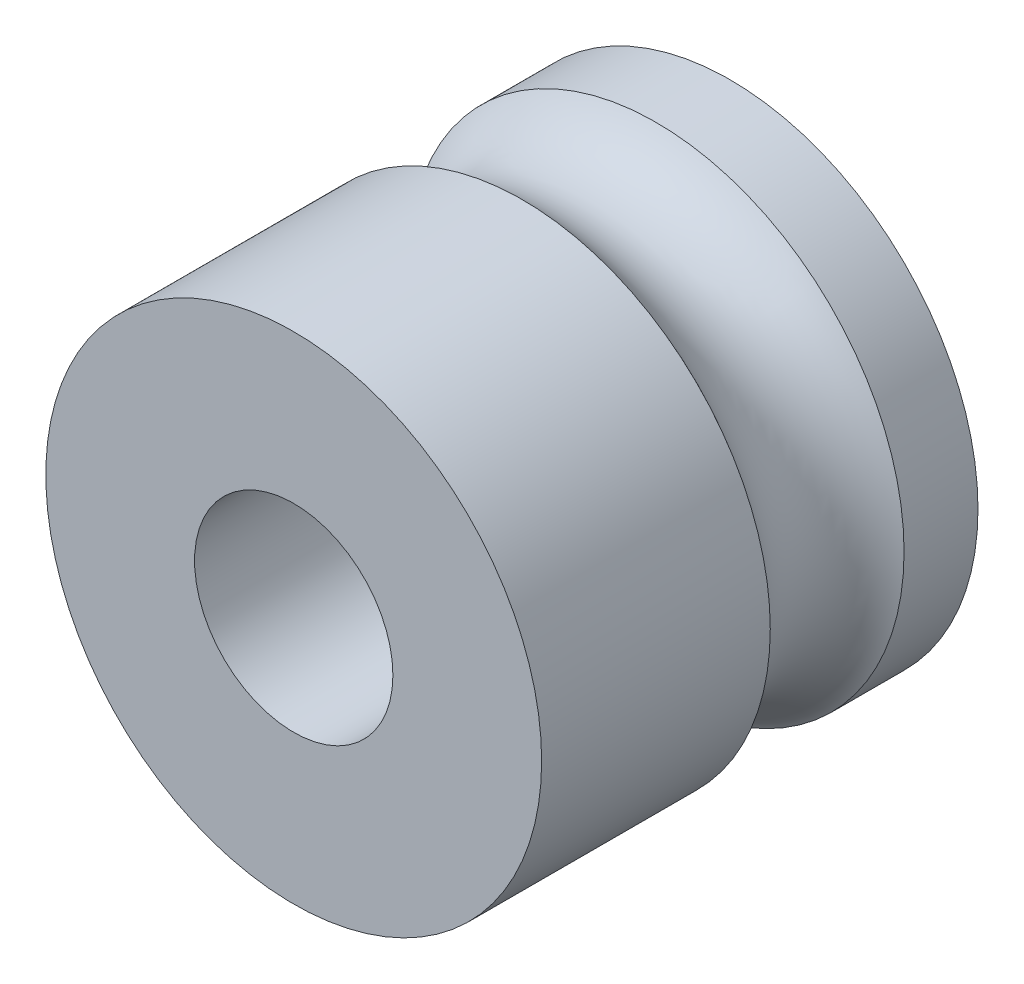
ISO-10303-21;
HEADER;
FILE_DESCRIPTION(('STEP AP214'),'2;1');
FILE_NAME('part.step','',(''),(''),'','','');
FILE_SCHEMA(('AUTOMOTIVE_DESIGN { 1 0 10303 214 1 1 1 1 }'));
ENDSEC;
DATA;
#1=APPLICATION_CONTEXT('core data for automotive mechanical design processes');
#2=APPLICATION_PROTOCOL_DEFINITION('international standard','automotive_design',2000,#1);
#3=PRODUCT_CONTEXT('',#1,'mechanical');
#4=PRODUCT('Part','Part','',(#3));
#5=PRODUCT_RELATED_PRODUCT_CATEGORY('part','',(#4));
#6=PRODUCT_DEFINITION_FORMATION('','',#4);
#7=PRODUCT_DEFINITION_CONTEXT('part definition',#1,'design');
#8=PRODUCT_DEFINITION('design','',#6,#7);
#9=PRODUCT_DEFINITION_SHAPE('','',#8);
#10=(LENGTH_UNIT() NAMED_UNIT(*) SI_UNIT(.MILLI.,.METRE.));
#11=(NAMED_UNIT(*) PLANE_ANGLE_UNIT() SI_UNIT($,.RADIAN.));
#12=(NAMED_UNIT(*) SI_UNIT($,.STERADIAN.) SOLID_ANGLE_UNIT());
#13=UNCERTAINTY_MEASURE_WITH_UNIT(LENGTH_MEASURE(1.E-05),#10,'distance_accuracy_value','');
#14=(GEOMETRIC_REPRESENTATION_CONTEXT(3) GLOBAL_UNCERTAINTY_ASSIGNED_CONTEXT((#13)) GLOBAL_UNIT_ASSIGNED_CONTEXT((#10,
#11,#12)) REPRESENTATION_CONTEXT('',''));
#15=CARTESIAN_POINT('',(0.,0.,0.));
#16=DIRECTION('',(0.,0.,1.));
#17=DIRECTION('',(1.,0.,0.));
#18=AXIS2_PLACEMENT_3D('',#15,#16,#17);
#19=CARTESIAN_POINT('',(0.,0.,3.55));
#20=DIRECTION('',(0.,0.,1.));
#21=DIRECTION('',(1.,0.,0.));
#22=AXIS2_PLACEMENT_3D('',#19,#20,#21);
#23=TOROIDAL_SURFACE('',#22,7.325,2.);
#24=CARTESIAN_POINT('',(0.,0.,1.86347250244771));
#25=DIRECTION('',(0.,0.,1.));
#26=DIRECTION('',(1.,0.,0.));
#27=AXIS2_PLACEMENT_3D('',#24,#25,#26);
#28=CIRCLE('',#27,6.25);
#29=CARTESIAN_POINT('',(6.25,0.,1.86347250244771));
#30=VERTEX_POINT('',#29);
#31=EDGE_CURVE('E52',#30,#30,#28,.T.);
#32=ORIENTED_EDGE('',*,*,#31,.T.);
#33=EDGE_LOOP('',(#32));
#34=FACE_BOUND('',#33,.T.);
#35=CARTESIAN_POINT('',(0.,0.,5.23652749755229));
#36=DIRECTION('',(0.,0.,1.));
#37=DIRECTION('',(1.,0.,0.));
#38=AXIS2_PLACEMENT_3D('',#35,#36,#37);
#39=CIRCLE('',#38,6.25);
#40=CARTESIAN_POINT('',(6.25,0.,5.23652749755229));
#41=VERTEX_POINT('',#40);
#42=EDGE_CURVE('E10',#41,#41,#39,.T.);
#43=ORIENTED_EDGE('',*,*,#42,.F.);
#44=EDGE_LOOP('',(#43));
#45=FACE_BOUND('',#44,.T.);
#46=ADVANCED_FACE('F30',(#34,#45),#23,.F.);
#47=CARTESIAN_POINT('',(0.,0.,0.));
#48=DIRECTION('',(0.,0.,1.));
#49=DIRECTION('',(1.,0.,0.));
#50=AXIS2_PLACEMENT_3D('',#47,#48,#49);
#51=CYLINDRICAL_SURFACE('',#50,6.25);
#52=ORIENTED_EDGE('',*,*,#42,.T.);
#53=EDGE_LOOP('',(#52));
#54=FACE_BOUND('',#53,.T.);
#55=CARTESIAN_POINT('',(0.,0.,11.));
#56=DIRECTION('',(0.,0.,1.));
#57=DIRECTION('',(1.,0.,0.));
#58=AXIS2_PLACEMENT_3D('',#55,#56,#57);
#59=CIRCLE('',#58,6.25);
#60=CARTESIAN_POINT('',(6.25,0.,11.));
#61=VERTEX_POINT('',#60);
#62=EDGE_CURVE('E36',#61,#61,#59,.T.);
#63=ORIENTED_EDGE('',*,*,#62,.F.);
#64=EDGE_LOOP('',(#63));
#65=FACE_BOUND('',#64,.T.);
#66=ADVANCED_FACE('F70',(#54,#65),#51,.T.);
#67=CARTESIAN_POINT('',(2.5,0.,11.));
#68=DIRECTION('',(0.,0.,1.));
#69=DIRECTION('',(1.,0.,0.));
#70=AXIS2_PLACEMENT_3D('',#67,#68,#69);
#71=PLANE('',#70);
#72=ORIENTED_EDGE('',*,*,#62,.T.);
#73=EDGE_LOOP('',(#72));
#74=FACE_BOUND('',#73,.T.);
#75=CARTESIAN_POINT('',(0.,0.,11.));
#76=DIRECTION('',(0.,0.,1.));
#77=DIRECTION('',(1.,0.,0.));
#78=AXIS2_PLACEMENT_3D('',#75,#76,#77);
#79=CIRCLE('',#78,2.5);
#80=CARTESIAN_POINT('',(2.5,0.,11.));
#81=VERTEX_POINT('',#80);
#82=EDGE_CURVE('E40',#81,#81,#79,.T.);
#83=ORIENTED_EDGE('',*,*,#82,.F.);
#84=EDGE_LOOP('',(#83));
#85=FACE_BOUND('',#84,.T.);
#86=ADVANCED_FACE('F74',(#74,#85),#71,.T.);
#87=CARTESIAN_POINT('',(0.,0.,0.));
#88=DIRECTION('',(0.,0.,1.));
#89=DIRECTION('',(1.,0.,0.));
#90=AXIS2_PLACEMENT_3D('',#87,#88,#89);
#91=CYLINDRICAL_SURFACE('',#90,2.5);
#92=ORIENTED_EDGE('',*,*,#82,.T.);
#93=EDGE_LOOP('',(#92));
#94=FACE_BOUND('',#93,.T.);
#95=CARTESIAN_POINT('',(0.,0.,0.));
#96=DIRECTION('',(0.,0.,1.));
#97=DIRECTION('',(1.,0.,0.));
#98=AXIS2_PLACEMENT_3D('',#95,#96,#97);
#99=CIRCLE('',#98,2.5);
#100=CARTESIAN_POINT('',(2.5,0.,0.));
#101=VERTEX_POINT('',#100);
#102=EDGE_CURVE('E44',#101,#101,#99,.T.);
#103=ORIENTED_EDGE('',*,*,#102,.F.);
#104=EDGE_LOOP('',(#103));
#105=FACE_BOUND('',#104,.T.);
#106=ADVANCED_FACE('F66',(#94,#105),#91,.F.);
#107=CARTESIAN_POINT('',(6.25,0.,0.));
#108=DIRECTION('',(0.,0.,-1.));
#109=DIRECTION('',(-1.,0.,0.));
#110=AXIS2_PLACEMENT_3D('',#107,#108,#109);
#111=PLANE('',#110);
#112=ORIENTED_EDGE('',*,*,#102,.T.);
#113=EDGE_LOOP('',(#112));
#114=FACE_BOUND('',#113,.T.);
#115=CARTESIAN_POINT('',(0.,0.,0.));
#116=DIRECTION('',(0.,0.,1.));
#117=DIRECTION('',(1.,0.,0.));
#118=AXIS2_PLACEMENT_3D('',#115,#116,#117);
#119=CIRCLE('',#118,6.25);
#120=CARTESIAN_POINT('',(6.25,0.,0.));
#121=VERTEX_POINT('',#120);
#122=EDGE_CURVE('E49',#121,#121,#119,.T.);
#123=ORIENTED_EDGE('',*,*,#122,.F.);
#124=EDGE_LOOP('',(#123));
#125=FACE_BOUND('',#124,.T.);
#126=ADVANCED_FACE('F60',(#114,#125),#111,.T.);
#127=CARTESIAN_POINT('',(0.,0.,0.));
#128=DIRECTION('',(0.,0.,1.));
#129=DIRECTION('',(1.,0.,0.));
#130=AXIS2_PLACEMENT_3D('',#127,#128,#129);
#131=CYLINDRICAL_SURFACE('',#130,6.25);
#132=ORIENTED_EDGE('',*,*,#122,.T.);
#133=EDGE_LOOP('',(#132));
#134=FACE_BOUND('',#133,.T.);
#135=ORIENTED_EDGE('',*,*,#31,.F.);
#136=EDGE_LOOP('',(#135));
#137=FACE_BOUND('',#136,.T.);
#138=ADVANCED_FACE('F58',(#134,#137),#131,.T.);
#139=CLOSED_SHELL('',(#46,#66,#86,#106,#126,#138));
#140=MANIFOLD_SOLID_BREP('B2',#139);
#141=ADVANCED_BREP_SHAPE_REPRESENTATION('',(#18,#140),#14);
#142=SHAPE_DEFINITION_REPRESENTATION(#9,#141);
ENDSEC;
END-ISO-10303-21;
